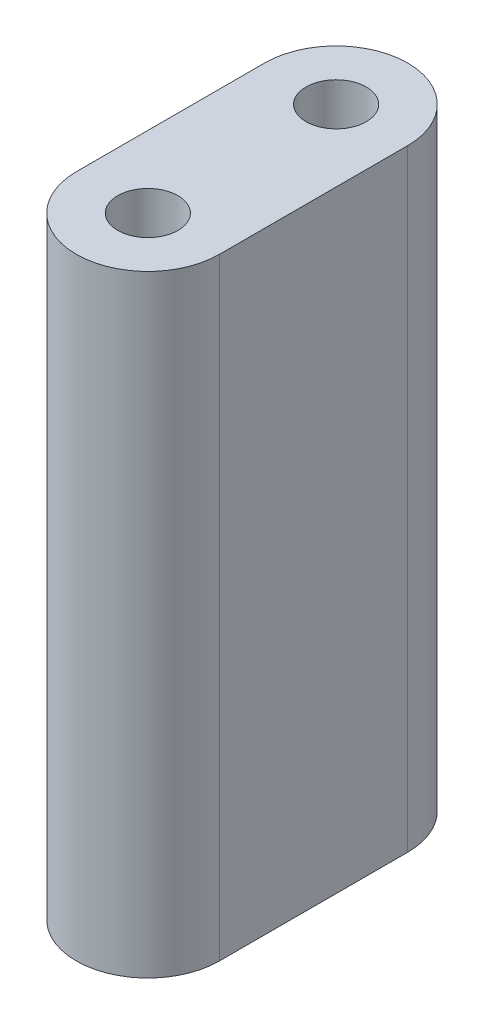
ISO-10303-21;
HEADER;
FILE_DESCRIPTION(('STEP AP214'),'2;1');
FILE_NAME('part.step','',(''),(''),'','','');
FILE_SCHEMA(('AUTOMOTIVE_DESIGN { 1 0 10303 214 1 1 1 1 }'));
ENDSEC;
DATA;
#1=APPLICATION_CONTEXT('core data for automotive mechanical design processes');
#2=APPLICATION_PROTOCOL_DEFINITION('international standard','automotive_design',2000,#1);
#3=PRODUCT_CONTEXT('',#1,'mechanical');
#4=PRODUCT('Part','Part','',(#3));
#5=PRODUCT_RELATED_PRODUCT_CATEGORY('part','',(#4));
#6=PRODUCT_DEFINITION_FORMATION('','',#4);
#7=PRODUCT_DEFINITION_CONTEXT('part definition',#1,'design');
#8=PRODUCT_DEFINITION('design','',#6,#7);
#9=PRODUCT_DEFINITION_SHAPE('','',#8);
#10=(LENGTH_UNIT() NAMED_UNIT(*) SI_UNIT(.MILLI.,.METRE.));
#11=(NAMED_UNIT(*) PLANE_ANGLE_UNIT() SI_UNIT($,.RADIAN.));
#12=(NAMED_UNIT(*) SI_UNIT($,.STERADIAN.) SOLID_ANGLE_UNIT());
#13=UNCERTAINTY_MEASURE_WITH_UNIT(LENGTH_MEASURE(1.E-05),#10,'distance_accuracy_value','');
#14=(GEOMETRIC_REPRESENTATION_CONTEXT(3) GLOBAL_UNCERTAINTY_ASSIGNED_CONTEXT((#13)) GLOBAL_UNIT_ASSIGNED_CONTEXT((#10,
#11,#12)) REPRESENTATION_CONTEXT('',''));
#15=CARTESIAN_POINT('',(0.,0.,0.));
#16=DIRECTION('',(0.,0.,1.));
#17=DIRECTION('',(1.,0.,0.));
#18=AXIS2_PLACEMENT_3D('',#15,#16,#17);
#19=CARTESIAN_POINT('',(0.,32.5,5.));
#20=DIRECTION('',(0.,-1.,0.));
#21=DIRECTION('',(0.,0.,-1.));
#22=AXIS2_PLACEMENT_3D('',#19,#20,#21);
#23=CYLINDRICAL_SURFACE('',#22,3.8);
#24=CARTESIAN_POINT('',(0.,0.,5.));
#25=DIRECTION('',(0.,1.,0.));
#26=DIRECTION('',(0.,0.,1.));
#27=AXIS2_PLACEMENT_3D('',#24,#25,#26);
#28=CIRCLE('',#27,3.8);
#29=CARTESIAN_POINT('',(-3.8,0.,5.));
#30=VERTEX_POINT('',#29);
#31=CARTESIAN_POINT('',(3.8,0.,5.));
#32=VERTEX_POINT('',#31);
#33=EDGE_CURVE('E98',#30,#32,#28,.T.);
#34=ORIENTED_EDGE('',*,*,#33,.T.);
#35=DIRECTION('',(0.,-1.,0.));
#36=VECTOR('',#35,1.);
#37=CARTESIAN_POINT('',(3.8,32.5,5.));
#38=LINE('',#37,#36);
#39=CARTESIAN_POINT('',(3.8,32.5,5.));
#40=VERTEX_POINT('',#39);
#41=EDGE_CURVE('E11',#40,#32,#38,.T.);
#42=ORIENTED_EDGE('',*,*,#41,.F.);
#43=CARTESIAN_POINT('',(0.,32.5,5.));
#44=DIRECTION('',(0.,1.,0.));
#45=DIRECTION('',(0.,0.,1.));
#46=AXIS2_PLACEMENT_3D('',#43,#44,#45);
#47=CIRCLE('',#46,3.8);
#48=CARTESIAN_POINT('',(-3.8,32.5,5.));
#49=VERTEX_POINT('',#48);
#50=EDGE_CURVE('E86',#49,#40,#47,.T.);
#51=ORIENTED_EDGE('',*,*,#50,.F.);
#52=DIRECTION('',(0.,-1.,0.));
#53=VECTOR('',#52,1.);
#54=CARTESIAN_POINT('',(-3.8,32.5,5.));
#55=LINE('',#54,#53);
#56=EDGE_CURVE('E94',#49,#30,#55,.T.);
#57=ORIENTED_EDGE('',*,*,#56,.T.);
#58=EDGE_LOOP('',(#34,#42,#51,#57));
#59=FACE_BOUND('',#58,.T.);
#60=ADVANCED_FACE('F35',(#59),#23,.T.);
#61=CARTESIAN_POINT('',(3.8,32.5,5.));
#62=DIRECTION('',(-1.,0.,0.));
#63=DIRECTION('',(0.,0.,1.));
#64=AXIS2_PLACEMENT_3D('',#61,#62,#63);
#65=PLANE('',#64);
#66=DIRECTION('',(0.,0.,-1.));
#67=VECTOR('',#66,1.);
#68=CARTESIAN_POINT('',(3.8,0.,5.));
#69=LINE('',#68,#67);
#70=CARTESIAN_POINT('',(3.8,0.,-5.));
#71=VERTEX_POINT('',#70);
#72=EDGE_CURVE('E90',#32,#71,#69,.T.);
#73=ORIENTED_EDGE('',*,*,#72,.T.);
#74=DIRECTION('',(0.,-1.,0.));
#75=VECTOR('',#74,1.);
#76=CARTESIAN_POINT('',(3.8,32.5,-5.));
#77=LINE('',#76,#75);
#78=CARTESIAN_POINT('',(3.8,32.5,-5.));
#79=VERTEX_POINT('',#78);
#80=EDGE_CURVE('E43',#79,#71,#77,.T.);
#81=ORIENTED_EDGE('',*,*,#80,.F.);
#82=DIRECTION('',(0.,0.,-1.));
#83=VECTOR('',#82,1.);
#84=CARTESIAN_POINT('',(3.8,32.5,5.));
#85=LINE('',#84,#83);
#86=EDGE_CURVE('E81',#40,#79,#85,.T.);
#87=ORIENTED_EDGE('',*,*,#86,.F.);
#88=ORIENTED_EDGE('',*,*,#41,.T.);
#89=EDGE_LOOP('',(#73,#81,#87,#88));
#90=FACE_BOUND('',#89,.T.);
#91=ADVANCED_FACE('F89',(#90),#65,.F.);
#92=CARTESIAN_POINT('',(0.,32.5,-5.));
#93=DIRECTION('',(0.,-1.,0.));
#94=DIRECTION('',(0.,0.,-1.));
#95=AXIS2_PLACEMENT_3D('',#92,#93,#94);
#96=CYLINDRICAL_SURFACE('',#95,3.8);
#97=CARTESIAN_POINT('',(0.,0.,-5.));
#98=DIRECTION('',(0.,1.,0.));
#99=DIRECTION('',(0.,0.,1.));
#100=AXIS2_PLACEMENT_3D('',#97,#98,#99);
#101=CIRCLE('',#100,3.8);
#102=CARTESIAN_POINT('',(-3.8,0.,-5.));
#103=VERTEX_POINT('',#102);
#104=EDGE_CURVE('E68',#71,#103,#101,.T.);
#105=ORIENTED_EDGE('',*,*,#104,.T.);
#106=DIRECTION('',(0.,-1.,0.));
#107=VECTOR('',#106,1.);
#108=CARTESIAN_POINT('',(-3.8,32.5,-5.));
#109=LINE('',#108,#107);
#110=CARTESIAN_POINT('',(-3.8,32.5,-5.));
#111=VERTEX_POINT('',#110);
#112=EDGE_CURVE('E91',#111,#103,#109,.T.);
#113=ORIENTED_EDGE('',*,*,#112,.F.);
#114=CARTESIAN_POINT('',(0.,32.5,-5.));
#115=DIRECTION('',(0.,1.,0.));
#116=DIRECTION('',(0.,0.,1.));
#117=AXIS2_PLACEMENT_3D('',#114,#115,#116);
#118=CIRCLE('',#117,3.8);
#119=EDGE_CURVE('E84',#79,#111,#118,.T.);
#120=ORIENTED_EDGE('',*,*,#119,.F.);
#121=ORIENTED_EDGE('',*,*,#80,.T.);
#122=EDGE_LOOP('',(#105,#113,#120,#121));
#123=FACE_BOUND('',#122,.T.);
#124=ADVANCED_FACE('F92',(#123),#96,.T.);
#125=CARTESIAN_POINT('',(-3.8,32.5,5.));
#126=DIRECTION('',(1.,0.,0.));
#127=DIRECTION('',(0.,0.,-1.));
#128=AXIS2_PLACEMENT_3D('',#125,#126,#127);
#129=PLANE('',#128);
#130=DIRECTION('',(0.,0.,1.));
#131=VECTOR('',#130,1.);
#132=CARTESIAN_POINT('',(-3.8,0.,5.));
#133=LINE('',#132,#131);
#134=EDGE_CURVE('E74',#103,#30,#133,.T.);
#135=ORIENTED_EDGE('',*,*,#134,.T.);
#136=ORIENTED_EDGE('',*,*,#56,.F.);
#137=DIRECTION('',(0.,0.,1.));
#138=VECTOR('',#137,1.);
#139=CARTESIAN_POINT('',(-3.8,32.5,5.));
#140=LINE('',#139,#138);
#141=EDGE_CURVE('E51',#111,#49,#140,.T.);
#142=ORIENTED_EDGE('',*,*,#141,.F.);
#143=ORIENTED_EDGE('',*,*,#112,.T.);
#144=EDGE_LOOP('',(#135,#136,#142,#143));
#145=FACE_BOUND('',#144,.T.);
#146=ADVANCED_FACE('F106',(#145),#129,.F.);
#147=CARTESIAN_POINT('',(0.,32.5,5.));
#148=DIRECTION('',(0.,1.,0.));
#149=DIRECTION('',(0.,0.,1.));
#150=AXIS2_PLACEMENT_3D('',#147,#148,#149);
#151=PLANE('',#150);
#152=CARTESIAN_POINT('',(0.,32.5,-5.));
#153=DIRECTION('',(0.,1.,0.));
#154=DIRECTION('',(0.,0.,1.));
#155=AXIS2_PLACEMENT_3D('',#152,#153,#154);
#156=CIRCLE('',#155,1.6);
#157=CARTESIAN_POINT('',(0.,32.5,-3.4));
#158=VERTEX_POINT('',#157);
#159=EDGE_CURVE('E118',#158,#158,#156,.T.);
#160=ORIENTED_EDGE('',*,*,#159,.F.);
#161=EDGE_LOOP('',(#160));
#162=FACE_BOUND('',#161,.T.);
#163=CARTESIAN_POINT('',(0.,32.5,5.));
#164=DIRECTION('',(0.,1.,0.));
#165=DIRECTION('',(0.,0.,1.));
#166=AXIS2_PLACEMENT_3D('',#163,#164,#165);
#167=CIRCLE('',#166,1.6);
#168=CARTESIAN_POINT('',(0.,32.5,6.6));
#169=VERTEX_POINT('',#168);
#170=EDGE_CURVE('E112',#169,#169,#167,.T.);
#171=ORIENTED_EDGE('',*,*,#170,.F.);
#172=EDGE_LOOP('',(#171));
#173=FACE_BOUND('',#172,.T.);
#174=ORIENTED_EDGE('',*,*,#50,.T.);
#175=ORIENTED_EDGE('',*,*,#86,.T.);
#176=ORIENTED_EDGE('',*,*,#119,.T.);
#177=ORIENTED_EDGE('',*,*,#141,.T.);
#178=EDGE_LOOP('',(#174,#175,#176,#177));
#179=FACE_BOUND('',#178,.T.);
#180=ADVANCED_FACE('F82',(#162,#173,#179),#151,.T.);
#181=CARTESIAN_POINT('',(0.,0.,5.));
#182=DIRECTION('',(0.,1.,0.));
#183=DIRECTION('',(0.,0.,1.));
#184=AXIS2_PLACEMENT_3D('',#181,#182,#183);
#185=PLANE('',#184);
#186=CARTESIAN_POINT('',(0.,0.,-5.));
#187=DIRECTION('',(0.,1.,0.));
#188=DIRECTION('',(0.,0.,1.));
#189=AXIS2_PLACEMENT_3D('',#186,#187,#188);
#190=CIRCLE('',#189,1.6);
#191=CARTESIAN_POINT('',(0.,0.,-3.4));
#192=VERTEX_POINT('',#191);
#193=EDGE_CURVE('E101',#192,#192,#190,.T.);
#194=ORIENTED_EDGE('',*,*,#193,.T.);
#195=EDGE_LOOP('',(#194));
#196=FACE_BOUND('',#195,.T.);
#197=CARTESIAN_POINT('',(0.,0.,5.));
#198=DIRECTION('',(0.,1.,0.));
#199=DIRECTION('',(0.,0.,1.));
#200=AXIS2_PLACEMENT_3D('',#197,#198,#199);
#201=CIRCLE('',#200,1.6);
#202=CARTESIAN_POINT('',(0.,0.,6.6));
#203=VERTEX_POINT('',#202);
#204=EDGE_CURVE('E115',#203,#203,#201,.T.);
#205=ORIENTED_EDGE('',*,*,#204,.T.);
#206=EDGE_LOOP('',(#205));
#207=FACE_BOUND('',#206,.T.);
#208=ORIENTED_EDGE('',*,*,#33,.F.);
#209=ORIENTED_EDGE('',*,*,#134,.F.);
#210=ORIENTED_EDGE('',*,*,#104,.F.);
#211=ORIENTED_EDGE('',*,*,#72,.F.);
#212=EDGE_LOOP('',(#208,#209,#210,#211));
#213=FACE_BOUND('',#212,.T.);
#214=ADVANCED_FACE('F109',(#196,#207,#213),#185,.F.);
#215=CARTESIAN_POINT('',(0.,0.,5.));
#216=DIRECTION('',(0.,1.,0.));
#217=DIRECTION('',(0.,0.,1.));
#218=AXIS2_PLACEMENT_3D('',#215,#216,#217);
#219=CYLINDRICAL_SURFACE('',#218,1.6);
#220=ORIENTED_EDGE('',*,*,#204,.F.);
#221=EDGE_LOOP('',(#220));
#222=FACE_BOUND('',#221,.T.);
#223=ORIENTED_EDGE('',*,*,#170,.T.);
#224=EDGE_LOOP('',(#223));
#225=FACE_BOUND('',#224,.T.);
#226=ADVANCED_FACE('F129',(#222,#225),#219,.F.);
#227=CARTESIAN_POINT('',(0.,0.,-5.));
#228=DIRECTION('',(0.,1.,0.));
#229=DIRECTION('',(0.,0.,1.));
#230=AXIS2_PLACEMENT_3D('',#227,#228,#229);
#231=CYLINDRICAL_SURFACE('',#230,1.6);
#232=ORIENTED_EDGE('',*,*,#193,.F.);
#233=EDGE_LOOP('',(#232));
#234=FACE_BOUND('',#233,.T.);
#235=ORIENTED_EDGE('',*,*,#159,.T.);
#236=EDGE_LOOP('',(#235));
#237=FACE_BOUND('',#236,.T.);
#238=ADVANCED_FACE('F126',(#234,#237),#231,.F.);
#239=CLOSED_SHELL('',(#60,#91,#124,#146,#180,#214,#226,#238));
#240=MANIFOLD_SOLID_BREP('B2',#239);
#241=ADVANCED_BREP_SHAPE_REPRESENTATION('',(#18,#240),#14);
#242=SHAPE_DEFINITION_REPRESENTATION(#9,#241);
ENDSEC;
END-ISO-10303-21;
